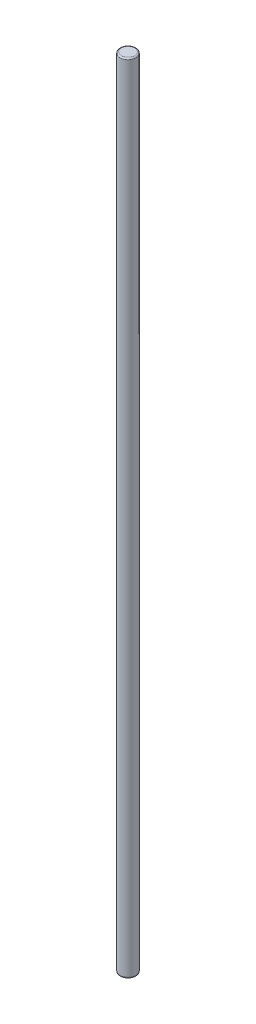
ISO-10303-21;
HEADER;
FILE_DESCRIPTION(('STEP AP214'),'2;1');
FILE_NAME('part.step','',(''),(''),'','','');
FILE_SCHEMA(('AUTOMOTIVE_DESIGN { 1 0 10303 214 1 1 1 1 }'));
ENDSEC;
DATA;
#1=APPLICATION_CONTEXT('core data for automotive mechanical design processes');
#2=APPLICATION_PROTOCOL_DEFINITION('international standard','automotive_design',2000,#1);
#3=PRODUCT_CONTEXT('',#1,'mechanical');
#4=PRODUCT('Part','Part','',(#3));
#5=PRODUCT_RELATED_PRODUCT_CATEGORY('part','',(#4));
#6=PRODUCT_DEFINITION_FORMATION('','',#4);
#7=PRODUCT_DEFINITION_CONTEXT('part definition',#1,'design');
#8=PRODUCT_DEFINITION('design','',#6,#7);
#9=PRODUCT_DEFINITION_SHAPE('','',#8);
#10=(LENGTH_UNIT() NAMED_UNIT(*) SI_UNIT(.MILLI.,.METRE.));
#11=(NAMED_UNIT(*) PLANE_ANGLE_UNIT() SI_UNIT($,.RADIAN.));
#12=(NAMED_UNIT(*) SI_UNIT($,.STERADIAN.) SOLID_ANGLE_UNIT());
#13=UNCERTAINTY_MEASURE_WITH_UNIT(LENGTH_MEASURE(1.E-05),#10,'distance_accuracy_value','');
#14=(GEOMETRIC_REPRESENTATION_CONTEXT(3) GLOBAL_UNCERTAINTY_ASSIGNED_CONTEXT((#13)) GLOBAL_UNIT_ASSIGNED_CONTEXT((#10,
#11,#12)) REPRESENTATION_CONTEXT('',''));
#15=CARTESIAN_POINT('',(0.,0.,0.));
#16=DIRECTION('',(0.,0.,1.));
#17=DIRECTION('',(1.,0.,0.));
#18=AXIS2_PLACEMENT_3D('',#15,#16,#17);
#19=CARTESIAN_POINT('',(0.,600.,0.));
#20=DIRECTION('',(0.,-1.,0.));
#21=DIRECTION('',(0.,0.,-1.));
#22=AXIS2_PLACEMENT_3D('',#19,#20,#21);
#23=CYLINDRICAL_SURFACE('',#22,6.);
#24=CARTESIAN_POINT('',(0.,1.,0.));
#25=DIRECTION('',(0.,1.,0.));
#26=DIRECTION('',(0.,0.,1.));
#27=AXIS2_PLACEMENT_3D('',#24,#25,#26);
#28=CIRCLE('',#27,6.);
#29=CARTESIAN_POINT('',(0.,1.,6.));
#30=VERTEX_POINT('',#29);
#31=EDGE_CURVE('E48',#30,#30,#28,.T.);
#32=ORIENTED_EDGE('',*,*,#31,.T.);
#33=EDGE_LOOP('',(#32));
#34=FACE_BOUND('',#33,.T.);
#35=CARTESIAN_POINT('',(0.,599.,0.));
#36=DIRECTION('',(0.,1.,0.));
#37=DIRECTION('',(0.,0.,1.));
#38=AXIS2_PLACEMENT_3D('',#35,#36,#37);
#39=CIRCLE('',#38,6.);
#40=CARTESIAN_POINT('',(0.,599.,6.));
#41=VERTEX_POINT('',#40);
#42=EDGE_CURVE('E52',#41,#41,#39,.F.);
#43=ORIENTED_EDGE('',*,*,#42,.T.);
#44=EDGE_LOOP('',(#43));
#45=FACE_BOUND('',#44,.T.);
#46=ADVANCED_FACE('F37',(#34,#45),#23,.T.);
#47=CARTESIAN_POINT('',(0.,600.,0.));
#48=DIRECTION('',(0.,1.,0.));
#49=DIRECTION('',(0.,0.,1.));
#50=AXIS2_PLACEMENT_3D('',#47,#48,#49);
#51=PLANE('',#50);
#52=CARTESIAN_POINT('',(0.,600.,0.));
#53=DIRECTION('',(0.,1.,0.));
#54=DIRECTION('',(0.,0.,1.));
#55=AXIS2_PLACEMENT_3D('',#52,#53,#54);
#56=CIRCLE('',#55,5.);
#57=CARTESIAN_POINT('',(0.,600.,5.));
#58=VERTEX_POINT('',#57);
#59=EDGE_CURVE('E10',#58,#58,#56,.T.);
#60=ORIENTED_EDGE('',*,*,#59,.T.);
#61=EDGE_LOOP('',(#60));
#62=FACE_BOUND('',#61,.T.);
#63=ADVANCED_FACE('F68',(#62),#51,.T.);
#64=CARTESIAN_POINT('',(0.,0.,0.));
#65=DIRECTION('',(0.,1.,0.));
#66=DIRECTION('',(0.,0.,1.));
#67=AXIS2_PLACEMENT_3D('',#64,#65,#66);
#68=PLANE('',#67);
#69=CARTESIAN_POINT('',(0.,0.,0.));
#70=DIRECTION('',(0.,1.,0.));
#71=DIRECTION('',(0.,0.,1.));
#72=AXIS2_PLACEMENT_3D('',#69,#70,#71);
#73=CIRCLE('',#72,5.);
#74=CARTESIAN_POINT('',(0.,0.,5.));
#75=VERTEX_POINT('',#74);
#76=EDGE_CURVE('E44',#75,#75,#73,.F.);
#77=ORIENTED_EDGE('',*,*,#76,.T.);
#78=EDGE_LOOP('',(#77));
#79=FACE_BOUND('',#78,.T.);
#80=ADVANCED_FACE('F65',(#79),#68,.F.);
#81=CARTESIAN_POINT('',(0.,1.,0.));
#82=DIRECTION('',(0.,1.,0.));
#83=DIRECTION('',(0.,0.,1.));
#84=AXIS2_PLACEMENT_3D('',#81,#82,#83);
#85=TOROIDAL_SURFACE('',#84,5.,1.);
#86=ORIENTED_EDGE('',*,*,#76,.F.);
#87=EDGE_LOOP('',(#86));
#88=FACE_BOUND('',#87,.T.);
#89=ORIENTED_EDGE('',*,*,#31,.F.);
#90=EDGE_LOOP('',(#89));
#91=FACE_BOUND('',#90,.T.);
#92=ADVANCED_FACE('F61',(#88,#91),#85,.T.);
#93=CARTESIAN_POINT('',(0.,599.,0.));
#94=DIRECTION('',(0.,1.,0.));
#95=DIRECTION('',(0.,0.,1.));
#96=AXIS2_PLACEMENT_3D('',#93,#94,#95);
#97=TOROIDAL_SURFACE('',#96,5.,1.);
#98=ORIENTED_EDGE('',*,*,#42,.F.);
#99=EDGE_LOOP('',(#98));
#100=FACE_BOUND('',#99,.T.);
#101=ORIENTED_EDGE('',*,*,#59,.F.);
#102=EDGE_LOOP('',(#101));
#103=FACE_BOUND('',#102,.T.);
#104=ADVANCED_FACE('F39',(#100,#103),#97,.T.);
#105=CLOSED_SHELL('',(#46,#63,#80,#92,#104));
#106=MANIFOLD_SOLID_BREP('B2',#105);
#107=ADVANCED_BREP_SHAPE_REPRESENTATION('',(#18,#106),#14);
#108=SHAPE_DEFINITION_REPRESENTATION(#9,#107);
ENDSEC;
END-ISO-10303-21;
